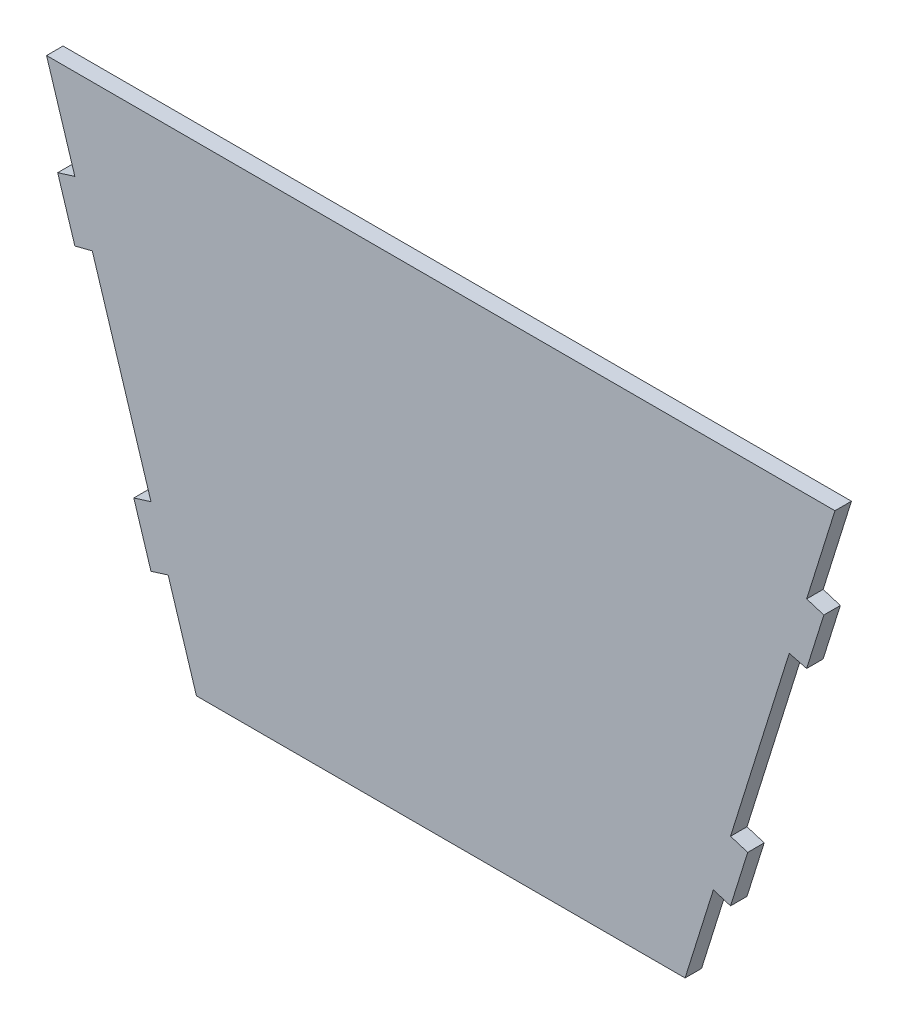
ISO-10303-21;
HEADER;
FILE_DESCRIPTION(('STEP AP214'),'2;1');
FILE_NAME('part.step','',(''),(''),'','','');
FILE_SCHEMA(('AUTOMOTIVE_DESIGN { 1 0 10303 214 1 1 1 1 }'));
ENDSEC;
DATA;
#1=APPLICATION_CONTEXT('core data for automotive mechanical design processes');
#2=APPLICATION_PROTOCOL_DEFINITION('international standard','automotive_design',2000,#1);
#3=PRODUCT_CONTEXT('',#1,'mechanical');
#4=PRODUCT('Part','Part','',(#3));
#5=PRODUCT_RELATED_PRODUCT_CATEGORY('part','',(#4));
#6=PRODUCT_DEFINITION_FORMATION('','',#4);
#7=PRODUCT_DEFINITION_CONTEXT('part definition',#1,'design');
#8=PRODUCT_DEFINITION('design','',#6,#7);
#9=PRODUCT_DEFINITION_SHAPE('','',#8);
#10=(LENGTH_UNIT() NAMED_UNIT(*) SI_UNIT(.MILLI.,.METRE.));
#11=(NAMED_UNIT(*) PLANE_ANGLE_UNIT() SI_UNIT($,.RADIAN.));
#12=(NAMED_UNIT(*) SI_UNIT($,.STERADIAN.) SOLID_ANGLE_UNIT());
#13=UNCERTAINTY_MEASURE_WITH_UNIT(LENGTH_MEASURE(1.E-05),#10,'distance_accuracy_value','');
#14=(GEOMETRIC_REPRESENTATION_CONTEXT(3) GLOBAL_UNCERTAINTY_ASSIGNED_CONTEXT((#13)) GLOBAL_UNIT_ASSIGNED_CONTEXT((#10,
#11,#12)) REPRESENTATION_CONTEXT('',''));
#15=CARTESIAN_POINT('',(0.,0.,0.));
#16=DIRECTION('',(0.,0.,1.));
#17=DIRECTION('',(1.,0.,0.));
#18=AXIS2_PLACEMENT_3D('',#15,#16,#17);
#19=CARTESIAN_POINT('',(23.9066948398571,76.5014234875444,2.75));
#20=DIRECTION('',(0.29827499313594,0.954479978035032,0.));
#21=DIRECTION('',(-0.954479978035032,0.29827499313594,0.));
#22=AXIS2_PLACEMENT_3D('',#19,#20,#21);
#23=PLANE('',#22);
#24=DIRECTION('',(0.954479978035032,-0.29827499313594,0.));
#25=VECTOR('',#24,1.);
#26=CARTESIAN_POINT('',(23.9066948398571,76.5014234875444,0.));
#27=LINE('',#26,#25);
#28=CARTESIAN_POINT('',(61.03125,64.9,0.));
#29=VERTEX_POINT('',#28);
#30=CARTESIAN_POINT('',(63.8946899341051,64.0051750205922,0.));
#31=VERTEX_POINT('',#30);
#32=EDGE_CURVE('E211',#29,#31,#27,.T.);
#33=ORIENTED_EDGE('',*,*,#32,.F.);
#34=DIRECTION('',(0.,0.,-1.));
#35=VECTOR('',#34,1.);
#36=CARTESIAN_POINT('',(61.03125,64.9,2.75));
#37=LINE('',#36,#35);
#38=CARTESIAN_POINT('',(61.03125,64.9,2.75));
#39=VERTEX_POINT('',#38);
#40=EDGE_CURVE('E11',#39,#29,#37,.T.);
#41=ORIENTED_EDGE('',*,*,#40,.F.);
#42=DIRECTION('',(0.954479978035032,-0.29827499313594,0.));
#43=VECTOR('',#42,1.);
#44=CARTESIAN_POINT('',(23.9066948398571,76.5014234875444,2.75));
#45=LINE('',#44,#43);
#46=CARTESIAN_POINT('',(63.8946899341051,64.0051750205922,2.75));
#47=VERTEX_POINT('',#46);
#48=EDGE_CURVE('E282',#39,#47,#45,.T.);
#49=ORIENTED_EDGE('',*,*,#48,.T.);
#50=DIRECTION('',(0.,0.,-1.));
#51=VECTOR('',#50,1.);
#52=CARTESIAN_POINT('',(63.8946899341051,64.0051750205922,2.75));
#53=LINE('',#52,#51);
#54=EDGE_CURVE('E58',#47,#31,#53,.T.);
#55=ORIENTED_EDGE('',*,*,#54,.T.);
#56=EDGE_LOOP('',(#33,#41,#49,#55));
#57=FACE_BOUND('',#56,.T.);
#58=ADVANCED_FACE('F41',(#57),#23,.T.);
#59=CARTESIAN_POINT('',(37.1245551601422,-11.6014234875445,2.75));
#60=DIRECTION('',(-0.954479978035029,0.298274993135948,0.));
#61=DIRECTION('',(-0.298274993135948,-0.954479978035029,0.));
#62=AXIS2_PLACEMENT_3D('',#59,#60,#61);
#63=PLANE('',#62);
#64=DIRECTION('',(0.298274993135948,0.954479978035029,0.));
#65=VECTOR('',#64,1.);
#66=CARTESIAN_POINT('',(37.1245551601422,-11.6014234875445,0.));
#67=LINE('',#66,#65);
#68=CARTESIAN_POINT('',(65.75,80.,0.));
#69=VERTEX_POINT('',#68);
#70=EDGE_CURVE('E214',#29,#69,#67,.T.);
#71=ORIENTED_EDGE('',*,*,#70,.T.);
#72=DIRECTION('',(0.,0.,-1.));
#73=VECTOR('',#72,1.);
#74=CARTESIAN_POINT('',(65.75,80.,2.75));
#75=LINE('',#74,#73);
#76=CARTESIAN_POINT('',(65.75,80.,2.75));
#77=VERTEX_POINT('',#76);
#78=EDGE_CURVE('E50',#77,#69,#75,.T.);
#79=ORIENTED_EDGE('',*,*,#78,.F.);
#80=DIRECTION('',(0.298274993135948,0.954479978035029,0.));
#81=VECTOR('',#80,1.);
#82=CARTESIAN_POINT('',(37.1245551601422,-11.6014234875445,2.75));
#83=LINE('',#82,#81);
#84=EDGE_CURVE('E363',#39,#77,#83,.T.);
#85=ORIENTED_EDGE('',*,*,#84,.F.);
#86=ORIENTED_EDGE('',*,*,#40,.T.);
#87=EDGE_LOOP('',(#71,#79,#85,#86));
#88=FACE_BOUND('',#87,.T.);
#89=ADVANCED_FACE('F420',(#88),#63,.F.);
#90=CARTESIAN_POINT('',(0.,80.,2.75));
#91=DIRECTION('',(0.,-1.,0.));
#92=DIRECTION('',(0.,0.,-1.));
#93=AXIS2_PLACEMENT_3D('',#90,#91,#92);
#94=PLANE('',#93);
#95=DIRECTION('',(-1.,0.,0.));
#96=VECTOR('',#95,1.);
#97=CARTESIAN_POINT('',(0.,80.,0.));
#98=LINE('',#97,#96);
#99=CARTESIAN_POINT('',(-65.75,80.,0.));
#100=VERTEX_POINT('',#99);
#101=EDGE_CURVE('E217',#69,#100,#98,.T.);
#102=ORIENTED_EDGE('',*,*,#101,.T.);
#103=DIRECTION('',(0.,0.,-1.));
#104=VECTOR('',#103,1.);
#105=CARTESIAN_POINT('',(-65.75,80.,2.75));
#106=LINE('',#105,#104);
#107=CARTESIAN_POINT('',(-65.75,80.,2.75));
#108=VERTEX_POINT('',#107);
#109=EDGE_CURVE('E332',#108,#100,#106,.T.);
#110=ORIENTED_EDGE('',*,*,#109,.F.);
#111=DIRECTION('',(-1.,0.,0.));
#112=VECTOR('',#111,1.);
#113=CARTESIAN_POINT('',(0.,80.,2.75));
#114=LINE('',#113,#112);
#115=EDGE_CURVE('E342',#77,#108,#114,.T.);
#116=ORIENTED_EDGE('',*,*,#115,.F.);
#117=ORIENTED_EDGE('',*,*,#78,.T.);
#118=EDGE_LOOP('',(#102,#110,#116,#117));
#119=FACE_BOUND('',#118,.T.);
#120=ADVANCED_FACE('F340',(#119),#94,.F.);
#121=CARTESIAN_POINT('',(-37.1245551601422,-11.6014234875445,2.75));
#122=DIRECTION('',(-0.954479978035029,-0.298274993135948,0.));
#123=DIRECTION('',(0.298274993135948,-0.954479978035029,0.));
#124=AXIS2_PLACEMENT_3D('',#121,#122,#123);
#125=PLANE('',#124);
#126=DIRECTION('',(-0.298274993135948,0.954479978035029,0.));
#127=VECTOR('',#126,1.);
#128=CARTESIAN_POINT('',(-37.1245551601422,-11.6014234875445,0.));
#129=LINE('',#128,#127);
#130=CARTESIAN_POINT('',(-61.03125,64.9,0.));
#131=VERTEX_POINT('',#130);
#132=EDGE_CURVE('E221',#131,#100,#129,.T.);
#133=ORIENTED_EDGE('',*,*,#132,.F.);
#134=DIRECTION('',(0.,0.,-1.));
#135=VECTOR('',#134,1.);
#136=CARTESIAN_POINT('',(-61.03125,64.9,2.75));
#137=LINE('',#136,#135);
#138=CARTESIAN_POINT('',(-61.03125,64.9,2.75));
#139=VERTEX_POINT('',#138);
#140=EDGE_CURVE('E329',#139,#131,#137,.T.);
#141=ORIENTED_EDGE('',*,*,#140,.F.);
#142=DIRECTION('',(-0.298274993135948,0.954479978035029,0.));
#143=VECTOR('',#142,1.);
#144=CARTESIAN_POINT('',(-37.1245551601422,-11.6014234875445,2.75));
#145=LINE('',#144,#143);
#146=EDGE_CURVE('E355',#139,#108,#145,.T.);
#147=ORIENTED_EDGE('',*,*,#146,.T.);
#148=ORIENTED_EDGE('',*,*,#109,.T.);
#149=EDGE_LOOP('',(#133,#141,#147,#148));
#150=FACE_BOUND('',#149,.T.);
#151=ADVANCED_FACE('F351',(#150),#125,.T.);
#152=CARTESIAN_POINT('',(-23.9066948398571,76.5014234875444,2.75));
#153=DIRECTION('',(0.29827499313594,-0.954479978035032,0.));
#154=DIRECTION('',(0.954479978035032,0.29827499313594,0.));
#155=AXIS2_PLACEMENT_3D('',#152,#153,#154);
#156=PLANE('',#155);
#157=DIRECTION('',(-0.954479978035032,-0.29827499313594,0.));
#158=VECTOR('',#157,1.);
#159=CARTESIAN_POINT('',(-23.9066948398571,76.5014234875444,0.));
#160=LINE('',#159,#158);
#161=CARTESIAN_POINT('',(-63.8946899341051,64.0051750205922,0.));
#162=VERTEX_POINT('',#161);
#163=EDGE_CURVE('E225',#131,#162,#160,.T.);
#164=ORIENTED_EDGE('',*,*,#163,.T.);
#165=DIRECTION('',(0.,0.,-1.));
#166=VECTOR('',#165,1.);
#167=CARTESIAN_POINT('',(-63.8946899341051,64.0051750205922,2.75));
#168=LINE('',#167,#166);
#169=CARTESIAN_POINT('',(-63.8946899341051,64.0051750205922,2.75));
#170=VERTEX_POINT('',#169);
#171=EDGE_CURVE('E325',#170,#162,#168,.T.);
#172=ORIENTED_EDGE('',*,*,#171,.F.);
#173=DIRECTION('',(-0.954479978035032,-0.29827499313594,0.));
#174=VECTOR('',#173,1.);
#175=CARTESIAN_POINT('',(-23.9066948398571,76.5014234875444,2.75));
#176=LINE('',#175,#174);
#177=EDGE_CURVE('E357',#139,#170,#176,.T.);
#178=ORIENTED_EDGE('',*,*,#177,.F.);
#179=ORIENTED_EDGE('',*,*,#140,.T.);
#180=EDGE_LOOP('',(#164,#172,#178,#179));
#181=FACE_BOUND('',#180,.T.);
#182=ADVANCED_FACE('F431',(#181),#156,.F.);
#183=CARTESIAN_POINT('',(-39.9532058288591,-12.5025206196637,2.75));
#184=DIRECTION('',(0.954363317399279,0.298648051061184,0.));
#185=DIRECTION('',(-0.298648051061184,0.954363317399279,0.));
#186=AXIS2_PLACEMENT_3D('',#183,#184,#185);
#187=PLANE('',#186);
#188=DIRECTION('',(0.298648051061184,-0.954363317399279,0.));
#189=VECTOR('',#188,1.);
#190=CARTESIAN_POINT('',(-39.9532058288591,-12.5025206196637,0.));
#191=LINE('',#190,#189);
#192=CARTESIAN_POINT('',(-61.0276686439177,54.8432871735591,0.));
#193=VERTEX_POINT('',#192);
#194=EDGE_CURVE('E228',#162,#193,#191,.T.);
#195=ORIENTED_EDGE('',*,*,#194,.T.);
#196=DIRECTION('',(0.,0.,-1.));
#197=VECTOR('',#196,1.);
#198=CARTESIAN_POINT('',(-61.0276686439177,54.8432871735591,2.75));
#199=LINE('',#198,#197);
#200=CARTESIAN_POINT('',(-61.0276686439177,54.8432871735591,2.75));
#201=VERTEX_POINT('',#200);
#202=EDGE_CURVE('E322',#201,#193,#199,.T.);
#203=ORIENTED_EDGE('',*,*,#202,.F.);
#204=DIRECTION('',(0.298648051061184,-0.954363317399279,0.));
#205=VECTOR('',#204,1.);
#206=CARTESIAN_POINT('',(-39.9532058288591,-12.5025206196637,2.75));
#207=LINE('',#206,#205);
#208=EDGE_CURVE('E361',#170,#201,#207,.T.);
#209=ORIENTED_EDGE('',*,*,#208,.F.);
#210=ORIENTED_EDGE('',*,*,#171,.T.);
#211=EDGE_LOOP('',(#195,#203,#209,#210));
#212=FACE_BOUND('',#211,.T.);
#213=ADVANCED_FACE('F434',(#212),#187,.F.);
#214=CARTESIAN_POINT('',(-17.1039044792077,66.1929526134402,2.75));
#215=DIRECTION('',(0.250177680199784,-0.968199942331053,0.));
#216=DIRECTION('',(0.968199942331053,0.250177680199784,0.));
#217=AXIS2_PLACEMENT_3D('',#214,#215,#216);
#218=PLANE('',#217);
#219=DIRECTION('',(-0.968199942331053,-0.250177680199784,0.));
#220=VECTOR('',#219,1.);
#221=CARTESIAN_POINT('',(-17.1039044792077,66.1929526134402,0.));
#222=LINE('',#221,#220);
#223=CARTESIAN_POINT('',(-58.1230688169245,55.5938202141585,0.));
#224=VERTEX_POINT('',#223);
#225=EDGE_CURVE('E232',#224,#193,#222,.T.);
#226=ORIENTED_EDGE('',*,*,#225,.F.);
#227=DIRECTION('',(0.,0.,-1.));
#228=VECTOR('',#227,1.);
#229=CARTESIAN_POINT('',(-58.1230688169245,55.5938202141585,2.75));
#230=LINE('',#229,#228);
#231=CARTESIAN_POINT('',(-58.1230688169245,55.5938202141585,2.75));
#232=VERTEX_POINT('',#231);
#233=EDGE_CURVE('E319',#232,#224,#230,.T.);
#234=ORIENTED_EDGE('',*,*,#233,.F.);
#235=DIRECTION('',(-0.968199942331053,-0.250177680199784,0.));
#236=VECTOR('',#235,1.);
#237=CARTESIAN_POINT('',(-17.1039044792077,66.1929526134402,2.75));
#238=LINE('',#237,#236);
#239=EDGE_CURVE('E369',#232,#201,#238,.T.);
#240=ORIENTED_EDGE('',*,*,#239,.T.);
#241=ORIENTED_EDGE('',*,*,#202,.T.);
#242=EDGE_LOOP('',(#226,#234,#240,#241));
#243=FACE_BOUND('',#242,.T.);
#244=ADVANCED_FACE('F438',(#243),#218,.T.);
#245=CARTESIAN_POINT('',(-37.1245551601423,-11.6014234875445,2.75));
#246=DIRECTION('',(-0.95447997803503,-0.298274993135947,0.));
#247=DIRECTION('',(0.298274993135947,-0.95447997803503,0.));
#248=AXIS2_PLACEMENT_3D('',#245,#246,#247);
#249=PLANE('',#248);
#250=DIRECTION('',(-0.298274993135947,0.95447997803503,0.));
#251=VECTOR('',#250,1.);
#252=CARTESIAN_POINT('',(-37.1245551601423,-11.6014234875445,0.));
#253=LINE('',#252,#251);
#254=CARTESIAN_POINT('',(-48.3321899341051,24.2630077891363,0.));
#255=VERTEX_POINT('',#254);
#256=EDGE_CURVE('E236',#255,#224,#253,.T.);
#257=ORIENTED_EDGE('',*,*,#256,.F.);
#258=DIRECTION('',(0.,0.,-1.));
#259=VECTOR('',#258,1.);
#260=CARTESIAN_POINT('',(-48.3321899341051,24.2630077891363,2.75));
#261=LINE('',#260,#259);
#262=CARTESIAN_POINT('',(-48.3321899341051,24.2630077891363,2.75));
#263=VERTEX_POINT('',#262);
#264=EDGE_CURVE('E316',#263,#255,#261,.T.);
#265=ORIENTED_EDGE('',*,*,#264,.F.);
#266=DIRECTION('',(-0.298274993135947,0.95447997803503,0.));
#267=VECTOR('',#266,1.);
#268=CARTESIAN_POINT('',(-37.1245551601423,-11.6014234875445,2.75));
#269=LINE('',#268,#267);
#270=EDGE_CURVE('E373',#263,#232,#269,.T.);
#271=ORIENTED_EDGE('',*,*,#270,.T.);
#272=ORIENTED_EDGE('',*,*,#233,.T.);
#273=EDGE_LOOP('',(#257,#265,#271,#272));
#274=FACE_BOUND('',#273,.T.);
#275=ADVANCED_FACE('F442',(#274),#249,.T.);
#276=CARTESIAN_POINT('',(-11.2076347739628,35.8644312766808,2.75));
#277=DIRECTION('',(0.298274993135948,-0.954479978035029,0.));
#278=DIRECTION('',(0.954479978035029,0.298274993135948,0.));
#279=AXIS2_PLACEMENT_3D('',#276,#277,#278);
#280=PLANE('',#279);
#281=DIRECTION('',(-0.954479978035029,-0.298274993135948,0.));
#282=VECTOR('',#281,1.);
#283=CARTESIAN_POINT('',(-11.2076347739628,35.8644312766808,0.));
#284=LINE('',#283,#282);
#285=CARTESIAN_POINT('',(-51.1956298682102,23.3681828097284,0.));
#286=VERTEX_POINT('',#285);
#287=EDGE_CURVE('E240',#255,#286,#284,.T.);
#288=ORIENTED_EDGE('',*,*,#287,.T.);
#289=DIRECTION('',(0.,0.,-1.));
#290=VECTOR('',#289,1.);
#291=CARTESIAN_POINT('',(-51.1956298682102,23.3681828097284,2.75));
#292=LINE('',#291,#290);
#293=CARTESIAN_POINT('',(-51.1956298682102,23.3681828097284,2.75));
#294=VERTEX_POINT('',#293);
#295=EDGE_CURVE('E313',#294,#286,#292,.T.);
#296=ORIENTED_EDGE('',*,*,#295,.F.);
#297=DIRECTION('',(-0.954479978035029,-0.298274993135948,0.));
#298=VECTOR('',#297,1.);
#299=CARTESIAN_POINT('',(-11.2076347739628,35.8644312766808,2.75));
#300=LINE('',#299,#298);
#301=EDGE_CURVE('E377',#263,#294,#300,.T.);
#302=ORIENTED_EDGE('',*,*,#301,.F.);
#303=ORIENTED_EDGE('',*,*,#264,.T.);
#304=EDGE_LOOP('',(#288,#296,#302,#303));
#305=FACE_BOUND('',#304,.T.);
#306=ADVANCED_FACE('F446',(#305),#280,.F.);
#307=CARTESIAN_POINT('',(-39.9879950942474,-12.4962484669523,2.75));
#308=DIRECTION('',(-0.95447997803503,-0.298274993135947,0.));
#309=DIRECTION('',(0.298274993135947,-0.95447997803503,0.));
#310=AXIS2_PLACEMENT_3D('',#307,#308,#309);
#311=PLANE('',#310);
#312=DIRECTION('',(-0.298274993135947,0.95447997803503,0.));
#313=VECTOR('',#312,1.);
#314=CARTESIAN_POINT('',(-39.9879950942474,-12.4962484669523,0.));
#315=LINE('',#314,#313);
#316=CARTESIAN_POINT('',(-48.3321899341051,14.2051750205922,0.));
#317=VERTEX_POINT('',#316);
#318=EDGE_CURVE('E244',#317,#286,#315,.T.);
#319=ORIENTED_EDGE('',*,*,#318,.F.);
#320=DIRECTION('',(0.,0.,-1.));
#321=VECTOR('',#320,1.);
#322=CARTESIAN_POINT('',(-48.3321899341051,14.2051750205922,2.75));
#323=LINE('',#322,#321);
#324=CARTESIAN_POINT('',(-48.3321899341051,14.2051750205922,2.75));
#325=VERTEX_POINT('',#324);
#326=EDGE_CURVE('E310',#325,#317,#323,.T.);
#327=ORIENTED_EDGE('',*,*,#326,.F.);
#328=DIRECTION('',(-0.298274993135947,0.95447997803503,0.));
#329=VECTOR('',#328,1.);
#330=CARTESIAN_POINT('',(-39.9879950942474,-12.4962484669523,2.75));
#331=LINE('',#330,#329);
#332=EDGE_CURVE('E380',#325,#294,#331,.T.);
#333=ORIENTED_EDGE('',*,*,#332,.T.);
#334=ORIENTED_EDGE('',*,*,#295,.T.);
#335=EDGE_LOOP('',(#319,#327,#333,#334));
#336=FACE_BOUND('',#335,.T.);
#337=ADVANCED_FACE('F450',(#336),#311,.T.);
#338=CARTESIAN_POINT('',(-8.34419483985768,26.7014234875445,2.75));
#339=DIRECTION('',(0.298274993135947,-0.95447997803503,0.));
#340=DIRECTION('',(0.95447997803503,0.298274993135947,0.));
#341=AXIS2_PLACEMENT_3D('',#338,#339,#340);
#342=PLANE('',#341);
#343=DIRECTION('',(-0.95447997803503,-0.298274993135948,0.));
#344=VECTOR('',#343,1.);
#345=CARTESIAN_POINT('',(-8.34419483985768,26.7014234875445,0.));
#346=LINE('',#345,#344);
#347=CARTESIAN_POINT('',(-45.46875,15.1,0.));
#348=VERTEX_POINT('',#347);
#349=EDGE_CURVE('E248',#348,#317,#346,.T.);
#350=ORIENTED_EDGE('',*,*,#349,.F.);
#351=DIRECTION('',(0.,0.,-1.));
#352=VECTOR('',#351,1.);
#353=CARTESIAN_POINT('',(-45.46875,15.1,2.75));
#354=LINE('',#353,#352);
#355=CARTESIAN_POINT('',(-45.46875,15.1,2.75));
#356=VERTEX_POINT('',#355);
#357=EDGE_CURVE('E307',#356,#348,#354,.T.);
#358=ORIENTED_EDGE('',*,*,#357,.F.);
#359=DIRECTION('',(-0.95447997803503,-0.298274993135948,0.));
#360=VECTOR('',#359,1.);
#361=CARTESIAN_POINT('',(-8.34419483985768,26.7014234875445,2.75));
#362=LINE('',#361,#360);
#363=EDGE_CURVE('E384',#356,#325,#362,.T.);
#364=ORIENTED_EDGE('',*,*,#363,.T.);
#365=ORIENTED_EDGE('',*,*,#326,.T.);
#366=EDGE_LOOP('',(#350,#358,#364,#365));
#367=FACE_BOUND('',#366,.T.);
#368=ADVANCED_FACE('F454',(#367),#342,.T.);
#369=CARTESIAN_POINT('',(-37.1245551601424,-11.6014234875445,2.75));
#370=DIRECTION('',(-0.95447997803503,-0.298274993135946,0.));
#371=DIRECTION('',(0.298274993135947,-0.95447997803503,0.));
#372=AXIS2_PLACEMENT_3D('',#369,#370,#371);
#373=PLANE('',#372);
#374=DIRECTION('',(-0.298274993135947,0.95447997803503,0.));
#375=VECTOR('',#374,1.);
#376=CARTESIAN_POINT('',(-37.1245551601424,-11.6014234875445,0.));
#377=LINE('',#376,#375);
#378=CARTESIAN_POINT('',(-40.75,0.,0.));
#379=VERTEX_POINT('',#378);
#380=EDGE_CURVE('E252',#379,#348,#377,.T.);
#381=ORIENTED_EDGE('',*,*,#380,.F.);
#382=DIRECTION('',(0.,0.,-1.));
#383=VECTOR('',#382,1.);
#384=CARTESIAN_POINT('',(-40.75,0.,2.75));
#385=LINE('',#384,#383);
#386=CARTESIAN_POINT('',(-40.75,0.,2.75));
#387=VERTEX_POINT('',#386);
#388=EDGE_CURVE('E304',#387,#379,#385,.T.);
#389=ORIENTED_EDGE('',*,*,#388,.F.);
#390=DIRECTION('',(-0.298274993135947,0.95447997803503,0.));
#391=VECTOR('',#390,1.);
#392=CARTESIAN_POINT('',(-37.1245551601424,-11.6014234875445,2.75));
#393=LINE('',#392,#391);
#394=EDGE_CURVE('E388',#387,#356,#393,.T.);
#395=ORIENTED_EDGE('',*,*,#394,.T.);
#396=ORIENTED_EDGE('',*,*,#357,.T.);
#397=EDGE_LOOP('',(#381,#389,#395,#396));
#398=FACE_BOUND('',#397,.T.);
#399=ADVANCED_FACE('F458',(#398),#373,.T.);
#400=CARTESIAN_POINT('',(0.,0.,2.75));
#401=DIRECTION('',(0.,1.,0.));
#402=DIRECTION('',(0.,0.,1.));
#403=AXIS2_PLACEMENT_3D('',#400,#401,#402);
#404=PLANE('',#403);
#405=DIRECTION('',(1.,0.,0.));
#406=VECTOR('',#405,1.);
#407=CARTESIAN_POINT('',(0.,0.,0.));
#408=LINE('',#407,#406);
#409=CARTESIAN_POINT('',(40.75,0.,0.));
#410=VERTEX_POINT('',#409);
#411=EDGE_CURVE('E256',#379,#410,#408,.T.);
#412=ORIENTED_EDGE('',*,*,#411,.T.);
#413=DIRECTION('',(0.,0.,-1.));
#414=VECTOR('',#413,1.);
#415=CARTESIAN_POINT('',(40.75,0.,2.75));
#416=LINE('',#415,#414);
#417=CARTESIAN_POINT('',(40.75,0.,2.75));
#418=VERTEX_POINT('',#417);
#419=EDGE_CURVE('E300',#418,#410,#416,.T.);
#420=ORIENTED_EDGE('',*,*,#419,.F.);
#421=DIRECTION('',(1.,0.,0.));
#422=VECTOR('',#421,1.);
#423=CARTESIAN_POINT('',(0.,0.,2.75));
#424=LINE('',#423,#422);
#425=EDGE_CURVE('E392',#387,#418,#424,.T.);
#426=ORIENTED_EDGE('',*,*,#425,.F.);
#427=ORIENTED_EDGE('',*,*,#388,.T.);
#428=EDGE_LOOP('',(#412,#420,#426,#427));
#429=FACE_BOUND('',#428,.T.);
#430=ADVANCED_FACE('F462',(#429),#404,.F.);
#431=CARTESIAN_POINT('',(37.1245551601424,-11.6014234875445,2.75));
#432=DIRECTION('',(-0.95447997803503,0.298274993135946,0.));
#433=DIRECTION('',(-0.298274993135947,-0.95447997803503,0.));
#434=AXIS2_PLACEMENT_3D('',#431,#432,#433);
#435=PLANE('',#434);
#436=DIRECTION('',(0.298274993135947,0.95447997803503,0.));
#437=VECTOR('',#436,1.);
#438=CARTESIAN_POINT('',(37.1245551601424,-11.6014234875445,0.));
#439=LINE('',#438,#437);
#440=CARTESIAN_POINT('',(45.46875,15.1,0.));
#441=VERTEX_POINT('',#440);
#442=EDGE_CURVE('E259',#410,#441,#439,.T.);
#443=ORIENTED_EDGE('',*,*,#442,.T.);
#444=DIRECTION('',(0.,0.,-1.));
#445=VECTOR('',#444,1.);
#446=CARTESIAN_POINT('',(45.46875,15.1,2.75));
#447=LINE('',#446,#445);
#448=CARTESIAN_POINT('',(45.46875,15.1,2.75));
#449=VERTEX_POINT('',#448);
#450=EDGE_CURVE('E296',#449,#441,#447,.T.);
#451=ORIENTED_EDGE('',*,*,#450,.F.);
#452=DIRECTION('',(0.298274993135947,0.95447997803503,0.));
#453=VECTOR('',#452,1.);
#454=CARTESIAN_POINT('',(37.1245551601424,-11.6014234875445,2.75));
#455=LINE('',#454,#453);
#456=EDGE_CURVE('E395',#418,#449,#455,.T.);
#457=ORIENTED_EDGE('',*,*,#456,.F.);
#458=ORIENTED_EDGE('',*,*,#419,.T.);
#459=EDGE_LOOP('',(#443,#451,#457,#458));
#460=FACE_BOUND('',#459,.T.);
#461=ADVANCED_FACE('F466',(#460),#435,.F.);
#462=CARTESIAN_POINT('',(8.34419483985768,26.7014234875445,2.75));
#463=DIRECTION('',(0.298274993135947,0.95447997803503,0.));
#464=DIRECTION('',(-0.95447997803503,0.298274993135947,0.));
#465=AXIS2_PLACEMENT_3D('',#462,#463,#464);
#466=PLANE('',#465);
#467=DIRECTION('',(0.95447997803503,-0.298274993135948,0.));
#468=VECTOR('',#467,1.);
#469=CARTESIAN_POINT('',(8.34419483985768,26.7014234875445,0.));
#470=LINE('',#469,#468);
#471=CARTESIAN_POINT('',(48.3321899341051,14.2051750205922,0.));
#472=VERTEX_POINT('',#471);
#473=EDGE_CURVE('E262',#441,#472,#470,.T.);
#474=ORIENTED_EDGE('',*,*,#473,.T.);
#475=DIRECTION('',(0.,0.,-1.));
#476=VECTOR('',#475,1.);
#477=CARTESIAN_POINT('',(48.3321899341051,14.2051750205922,2.75));
#478=LINE('',#477,#476);
#479=CARTESIAN_POINT('',(48.3321899341051,14.2051750205922,2.75));
#480=VERTEX_POINT('',#479);
#481=EDGE_CURVE('E292',#480,#472,#478,.T.);
#482=ORIENTED_EDGE('',*,*,#481,.F.);
#483=DIRECTION('',(0.95447997803503,-0.298274993135948,0.));
#484=VECTOR('',#483,1.);
#485=CARTESIAN_POINT('',(8.34419483985768,26.7014234875445,2.75));
#486=LINE('',#485,#484);
#487=EDGE_CURVE('E398',#449,#480,#486,.T.);
#488=ORIENTED_EDGE('',*,*,#487,.F.);
#489=ORIENTED_EDGE('',*,*,#450,.T.);
#490=EDGE_LOOP('',(#474,#482,#488,#489));
#491=FACE_BOUND('',#490,.T.);
#492=ADVANCED_FACE('F470',(#491),#466,.F.);
#493=CARTESIAN_POINT('',(39.9879950942474,-12.4962484669523,2.75));
#494=DIRECTION('',(-0.95447997803503,0.298274993135947,0.));
#495=DIRECTION('',(-0.298274993135947,-0.95447997803503,0.));
#496=AXIS2_PLACEMENT_3D('',#493,#494,#495);
#497=PLANE('',#496);
#498=DIRECTION('',(0.298274993135947,0.95447997803503,0.));
#499=VECTOR('',#498,1.);
#500=CARTESIAN_POINT('',(39.9879950942474,-12.4962484669523,0.));
#501=LINE('',#500,#499);
#502=CARTESIAN_POINT('',(51.1956298682102,23.3681828097284,0.));
#503=VERTEX_POINT('',#502);
#504=EDGE_CURVE('E265',#472,#503,#501,.T.);
#505=ORIENTED_EDGE('',*,*,#504,.T.);
#506=DIRECTION('',(0.,0.,-1.));
#507=VECTOR('',#506,1.);
#508=CARTESIAN_POINT('',(51.1956298682102,23.3681828097284,2.75));
#509=LINE('',#508,#507);
#510=CARTESIAN_POINT('',(51.1956298682102,23.3681828097284,2.75));
#511=VERTEX_POINT('',#510);
#512=EDGE_CURVE('E289',#511,#503,#509,.T.);
#513=ORIENTED_EDGE('',*,*,#512,.F.);
#514=DIRECTION('',(0.298274993135947,0.95447997803503,0.));
#515=VECTOR('',#514,1.);
#516=CARTESIAN_POINT('',(39.9879950942474,-12.4962484669523,2.75));
#517=LINE('',#516,#515);
#518=EDGE_CURVE('E401',#480,#511,#517,.T.);
#519=ORIENTED_EDGE('',*,*,#518,.F.);
#520=ORIENTED_EDGE('',*,*,#481,.T.);
#521=EDGE_LOOP('',(#505,#513,#519,#520));
#522=FACE_BOUND('',#521,.T.);
#523=ADVANCED_FACE('F474',(#522),#497,.F.);
#524=CARTESIAN_POINT('',(11.2076347739628,35.8644312766808,2.75));
#525=DIRECTION('',(0.298274993135948,0.954479978035029,0.));
#526=DIRECTION('',(-0.954479978035029,0.298274993135948,0.));
#527=AXIS2_PLACEMENT_3D('',#524,#525,#526);
#528=PLANE('',#527);
#529=DIRECTION('',(0.954479978035029,-0.298274993135948,0.));
#530=VECTOR('',#529,1.);
#531=CARTESIAN_POINT('',(11.2076347739628,35.8644312766808,0.));
#532=LINE('',#531,#530);
#533=CARTESIAN_POINT('',(48.3321899341051,24.2630077891363,0.));
#534=VERTEX_POINT('',#533);
#535=EDGE_CURVE('E269',#534,#503,#532,.T.);
#536=ORIENTED_EDGE('',*,*,#535,.F.);
#537=DIRECTION('',(0.,0.,-1.));
#538=VECTOR('',#537,1.);
#539=CARTESIAN_POINT('',(48.3321899341051,24.2630077891363,2.75));
#540=LINE('',#539,#538);
#541=CARTESIAN_POINT('',(48.3321899341051,24.2630077891363,2.75));
#542=VERTEX_POINT('',#541);
#543=EDGE_CURVE('E201',#542,#534,#540,.T.);
#544=ORIENTED_EDGE('',*,*,#543,.F.);
#545=DIRECTION('',(0.954479978035029,-0.298274993135948,0.));
#546=VECTOR('',#545,1.);
#547=CARTESIAN_POINT('',(11.2076347739628,35.8644312766808,2.75));
#548=LINE('',#547,#546);
#549=EDGE_CURVE('E189',#542,#511,#548,.T.);
#550=ORIENTED_EDGE('',*,*,#549,.T.);
#551=ORIENTED_EDGE('',*,*,#512,.T.);
#552=EDGE_LOOP('',(#536,#544,#550,#551));
#553=FACE_BOUND('',#552,.T.);
#554=ADVANCED_FACE('F406',(#553),#528,.T.);
#555=CARTESIAN_POINT('',(37.1245551601423,-11.6014234875445,2.75));
#556=DIRECTION('',(-0.95447997803503,0.298274993135947,0.));
#557=DIRECTION('',(-0.298274993135947,-0.95447997803503,0.));
#558=AXIS2_PLACEMENT_3D('',#555,#556,#557);
#559=PLANE('',#558);
#560=DIRECTION('',(0.298274993135947,0.95447997803503,0.));
#561=VECTOR('',#560,1.);
#562=CARTESIAN_POINT('',(37.1245551601423,-11.6014234875445,0.));
#563=LINE('',#562,#561);
#564=CARTESIAN_POINT('',(58.1230688169245,55.5938202141585,0.));
#565=VERTEX_POINT('',#564);
#566=EDGE_CURVE('E197',#534,#565,#563,.T.);
#567=ORIENTED_EDGE('',*,*,#566,.T.);
#568=DIRECTION('',(0.,0.,-1.));
#569=VECTOR('',#568,1.);
#570=CARTESIAN_POINT('',(58.1230688169245,55.5938202141585,2.75));
#571=LINE('',#570,#569);
#572=CARTESIAN_POINT('',(58.1230688169245,55.5938202141585,2.75));
#573=VERTEX_POINT('',#572);
#574=EDGE_CURVE('E194',#573,#565,#571,.T.);
#575=ORIENTED_EDGE('',*,*,#574,.F.);
#576=DIRECTION('',(0.298274993135947,0.95447997803503,0.));
#577=VECTOR('',#576,1.);
#578=CARTESIAN_POINT('',(37.1245551601423,-11.6014234875445,2.75));
#579=LINE('',#578,#577);
#580=EDGE_CURVE('E181',#542,#573,#579,.T.);
#581=ORIENTED_EDGE('',*,*,#580,.F.);
#582=ORIENTED_EDGE('',*,*,#543,.T.);
#583=EDGE_LOOP('',(#567,#575,#581,#582));
#584=FACE_BOUND('',#583,.T.);
#585=ADVANCED_FACE('F195',(#584),#559,.F.);
#586=CARTESIAN_POINT('',(17.1039044792077,66.1929526134402,2.75));
#587=DIRECTION('',(0.250177680199784,0.968199942331053,0.));
#588=DIRECTION('',(-0.968199942331053,0.250177680199784,0.));
#589=AXIS2_PLACEMENT_3D('',#586,#587,#588);
#590=PLANE('',#589);
#591=DIRECTION('',(0.968199942331053,-0.250177680199784,0.));
#592=VECTOR('',#591,1.);
#593=CARTESIAN_POINT('',(17.1039044792077,66.1929526134402,0.));
#594=LINE('',#593,#592);
#595=CARTESIAN_POINT('',(61.0276686439177,54.8432871735591,0.));
#596=VERTEX_POINT('',#595);
#597=EDGE_CURVE('E275',#565,#596,#594,.T.);
#598=ORIENTED_EDGE('',*,*,#597,.T.);
#599=DIRECTION('',(0.,0.,-1.));
#600=VECTOR('',#599,1.);
#601=CARTESIAN_POINT('',(61.0276686439177,54.8432871735591,2.75));
#602=LINE('',#601,#600);
#603=CARTESIAN_POINT('',(61.0276686439177,54.8432871735591,2.75));
#604=VERTEX_POINT('',#603);
#605=EDGE_CURVE('E120',#604,#596,#602,.T.);
#606=ORIENTED_EDGE('',*,*,#605,.F.);
#607=DIRECTION('',(0.968199942331053,-0.250177680199784,0.));
#608=VECTOR('',#607,1.);
#609=CARTESIAN_POINT('',(17.1039044792077,66.1929526134402,2.75));
#610=LINE('',#609,#608);
#611=EDGE_CURVE('E187',#573,#604,#610,.T.);
#612=ORIENTED_EDGE('',*,*,#611,.F.);
#613=ORIENTED_EDGE('',*,*,#574,.T.);
#614=EDGE_LOOP('',(#598,#606,#612,#613));
#615=FACE_BOUND('',#614,.T.);
#616=ADVANCED_FACE('F203',(#615),#590,.F.);
#617=CARTESIAN_POINT('',(39.9532058288591,-12.5025206196637,2.75));
#618=DIRECTION('',(0.954363317399279,-0.298648051061184,0.));
#619=DIRECTION('',(0.298648051061184,0.954363317399279,0.));
#620=AXIS2_PLACEMENT_3D('',#617,#618,#619);
#621=PLANE('',#620);
#622=DIRECTION('',(-0.298648051061184,-0.954363317399279,0.));
#623=VECTOR('',#622,1.);
#624=CARTESIAN_POINT('',(39.9532058288591,-12.5025206196637,0.));
#625=LINE('',#624,#623);
#626=EDGE_CURVE('E278',#31,#596,#625,.T.);
#627=ORIENTED_EDGE('',*,*,#626,.F.);
#628=ORIENTED_EDGE('',*,*,#54,.F.);
#629=DIRECTION('',(-0.298648051061184,-0.954363317399279,0.));
#630=VECTOR('',#629,1.);
#631=CARTESIAN_POINT('',(39.9532058288591,-12.5025206196637,2.75));
#632=LINE('',#631,#630);
#633=EDGE_CURVE('E205',#47,#604,#632,.T.);
#634=ORIENTED_EDGE('',*,*,#633,.T.);
#635=ORIENTED_EDGE('',*,*,#605,.T.);
#636=EDGE_LOOP('',(#627,#628,#634,#635));
#637=FACE_BOUND('',#636,.T.);
#638=ADVANCED_FACE('F409',(#637),#621,.T.);
#639=CARTESIAN_POINT('',(0.,0.,2.75));
#640=DIRECTION('',(0.,0.,1.));
#641=DIRECTION('',(1.,0.,0.));
#642=AXIS2_PLACEMENT_3D('',#639,#640,#641);
#643=PLANE('',#642);
#644=ORIENTED_EDGE('',*,*,#48,.F.);
#645=ORIENTED_EDGE('',*,*,#84,.T.);
#646=ORIENTED_EDGE('',*,*,#115,.T.);
#647=ORIENTED_EDGE('',*,*,#146,.F.);
#648=ORIENTED_EDGE('',*,*,#177,.T.);
#649=ORIENTED_EDGE('',*,*,#208,.T.);
#650=ORIENTED_EDGE('',*,*,#239,.F.);
#651=ORIENTED_EDGE('',*,*,#270,.F.);
#652=ORIENTED_EDGE('',*,*,#301,.T.);
#653=ORIENTED_EDGE('',*,*,#332,.F.);
#654=ORIENTED_EDGE('',*,*,#363,.F.);
#655=ORIENTED_EDGE('',*,*,#394,.F.);
#656=ORIENTED_EDGE('',*,*,#425,.T.);
#657=ORIENTED_EDGE('',*,*,#456,.T.);
#658=ORIENTED_EDGE('',*,*,#487,.T.);
#659=ORIENTED_EDGE('',*,*,#518,.T.);
#660=ORIENTED_EDGE('',*,*,#549,.F.);
#661=ORIENTED_EDGE('',*,*,#580,.T.);
#662=ORIENTED_EDGE('',*,*,#611,.T.);
#663=ORIENTED_EDGE('',*,*,#633,.F.);
#664=EDGE_LOOP('',(#644,#645,#646,#647,#648,#649,#650,#651,#652,#653,#654,#655,#656,#657,#658,
#659,#660,#661,#662,#663));
#665=FACE_BOUND('',#664,.T.);
#666=ADVANCED_FACE('F184',(#665),#643,.T.);
#667=CARTESIAN_POINT('',(0.,0.,0.));
#668=DIRECTION('',(0.,0.,1.));
#669=DIRECTION('',(1.,0.,0.));
#670=AXIS2_PLACEMENT_3D('',#667,#668,#669);
#671=PLANE('',#670);
#672=ORIENTED_EDGE('',*,*,#32,.T.);
#673=ORIENTED_EDGE('',*,*,#626,.T.);
#674=ORIENTED_EDGE('',*,*,#597,.F.);
#675=ORIENTED_EDGE('',*,*,#566,.F.);
#676=ORIENTED_EDGE('',*,*,#535,.T.);
#677=ORIENTED_EDGE('',*,*,#504,.F.);
#678=ORIENTED_EDGE('',*,*,#473,.F.);
#679=ORIENTED_EDGE('',*,*,#442,.F.);
#680=ORIENTED_EDGE('',*,*,#411,.F.);
#681=ORIENTED_EDGE('',*,*,#380,.T.);
#682=ORIENTED_EDGE('',*,*,#349,.T.);
#683=ORIENTED_EDGE('',*,*,#318,.T.);
#684=ORIENTED_EDGE('',*,*,#287,.F.);
#685=ORIENTED_EDGE('',*,*,#256,.T.);
#686=ORIENTED_EDGE('',*,*,#225,.T.);
#687=ORIENTED_EDGE('',*,*,#194,.F.);
#688=ORIENTED_EDGE('',*,*,#163,.F.);
#689=ORIENTED_EDGE('',*,*,#132,.T.);
#690=ORIENTED_EDGE('',*,*,#101,.F.);
#691=ORIENTED_EDGE('',*,*,#70,.F.);
#692=EDGE_LOOP('',(#672,#673,#674,#675,#676,#677,#678,#679,#680,#681,#682,#683,#684,#685,#686,
#687,#688,#689,#690,#691));
#693=FACE_BOUND('',#692,.T.);
#694=ADVANCED_FACE('F346',(#693),#671,.F.);
#695=CLOSED_SHELL('',(#58,#89,#120,#151,#182,#213,#244,#275,#306,#337,#368,#399,#430,#461,#492,
#523,#554,#585,#616,#638,#666,#694));
#696=MANIFOLD_SOLID_BREP('B2',#695);
#697=ADVANCED_BREP_SHAPE_REPRESENTATION('',(#18,#696),#14);
#698=SHAPE_DEFINITION_REPRESENTATION(#9,#697);
ENDSEC;
END-ISO-10303-21;
